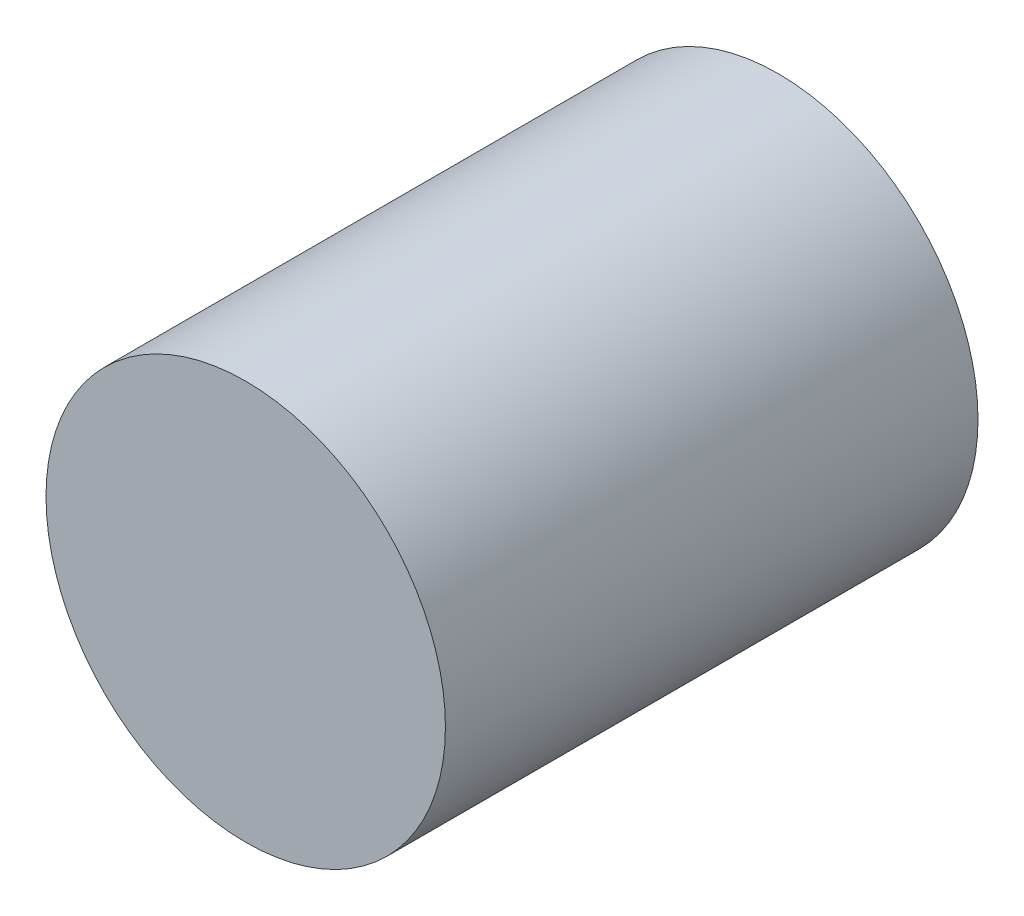
ISO-10303-21;
HEADER;
FILE_DESCRIPTION(('STEP AP214'),'2;1');
FILE_NAME('part.step','',(''),(''),'','','');
FILE_SCHEMA(('AUTOMOTIVE_DESIGN { 1 0 10303 214 1 1 1 1 }'));
ENDSEC;
DATA;
#1=APPLICATION_CONTEXT('core data for automotive mechanical design processes');
#2=APPLICATION_PROTOCOL_DEFINITION('international standard','automotive_design',2000,#1);
#3=PRODUCT_CONTEXT('',#1,'mechanical');
#4=PRODUCT('Part','Part','',(#3));
#5=PRODUCT_RELATED_PRODUCT_CATEGORY('part','',(#4));
#6=PRODUCT_DEFINITION_FORMATION('','',#4);
#7=PRODUCT_DEFINITION_CONTEXT('part definition',#1,'design');
#8=PRODUCT_DEFINITION('design','',#6,#7);
#9=PRODUCT_DEFINITION_SHAPE('','',#8);
#10=(LENGTH_UNIT() NAMED_UNIT(*) SI_UNIT(.MILLI.,.METRE.));
#11=(NAMED_UNIT(*) PLANE_ANGLE_UNIT() SI_UNIT($,.RADIAN.));
#12=(NAMED_UNIT(*) SI_UNIT($,.STERADIAN.) SOLID_ANGLE_UNIT());
#13=UNCERTAINTY_MEASURE_WITH_UNIT(LENGTH_MEASURE(1.E-05),#10,'distance_accuracy_value','');
#14=(GEOMETRIC_REPRESENTATION_CONTEXT(3) GLOBAL_UNCERTAINTY_ASSIGNED_CONTEXT((#13)) GLOBAL_UNIT_ASSIGNED_CONTEXT((#10,
#11,#12)) REPRESENTATION_CONTEXT('',''));
#15=CARTESIAN_POINT('',(0.,0.,0.));
#16=DIRECTION('',(0.,0.,1.));
#17=DIRECTION('',(1.,0.,0.));
#18=AXIS2_PLACEMENT_3D('',#15,#16,#17);
#19=CARTESIAN_POINT('',(0.,0.,2.));
#20=DIRECTION('',(0.,0.,-1.));
#21=DIRECTION('',(-1.,0.,0.));
#22=AXIS2_PLACEMENT_3D('',#19,#20,#21);
#23=CYLINDRICAL_SURFACE('',#22,0.75);
#24=CARTESIAN_POINT('',(0.,0.,2.));
#25=DIRECTION('',(0.,0.,1.));
#26=DIRECTION('',(1.,0.,0.));
#27=AXIS2_PLACEMENT_3D('',#24,#25,#26);
#28=CIRCLE('',#27,0.75);
#29=CARTESIAN_POINT('',(0.75,0.,2.));
#30=VERTEX_POINT('',#29);
#31=EDGE_CURVE('E10',#30,#30,#28,.T.);
#32=ORIENTED_EDGE('',*,*,#31,.F.);
#33=EDGE_LOOP('',(#32));
#34=FACE_BOUND('',#33,.T.);
#35=CARTESIAN_POINT('',(0.,0.,0.));
#36=DIRECTION('',(0.,0.,1.));
#37=DIRECTION('',(1.,0.,0.));
#38=AXIS2_PLACEMENT_3D('',#35,#36,#37);
#39=CIRCLE('',#38,0.75);
#40=CARTESIAN_POINT('',(0.75,0.,0.));
#41=VERTEX_POINT('',#40);
#42=EDGE_CURVE('E40',#41,#41,#39,.T.);
#43=ORIENTED_EDGE('',*,*,#42,.T.);
#44=EDGE_LOOP('',(#43));
#45=FACE_BOUND('',#44,.T.);
#46=ADVANCED_FACE('F37',(#34,#45),#23,.T.);
#47=CARTESIAN_POINT('',(0.,0.,2.));
#48=DIRECTION('',(0.,0.,1.));
#49=DIRECTION('',(1.,0.,0.));
#50=AXIS2_PLACEMENT_3D('',#47,#48,#49);
#51=PLANE('',#50);
#52=ORIENTED_EDGE('',*,*,#31,.T.);
#53=EDGE_LOOP('',(#52));
#54=FACE_BOUND('',#53,.T.);
#55=ADVANCED_FACE('F54',(#54),#51,.T.);
#56=CARTESIAN_POINT('',(0.,0.,0.));
#57=DIRECTION('',(0.,0.,1.));
#58=DIRECTION('',(1.,0.,0.));
#59=AXIS2_PLACEMENT_3D('',#56,#57,#58);
#60=PLANE('',#59);
#61=ORIENTED_EDGE('',*,*,#42,.F.);
#62=EDGE_LOOP('',(#61));
#63=FACE_BOUND('',#62,.T.);
#64=ADVANCED_FACE('F52',(#63),#60,.F.);
#65=CLOSED_SHELL('',(#46,#55,#64));
#66=MANIFOLD_SOLID_BREP('B2',#65);
#67=ADVANCED_BREP_SHAPE_REPRESENTATION('',(#18,#66),#14);
#68=SHAPE_DEFINITION_REPRESENTATION(#9,#67);
ENDSEC;
END-ISO-10303-21;
